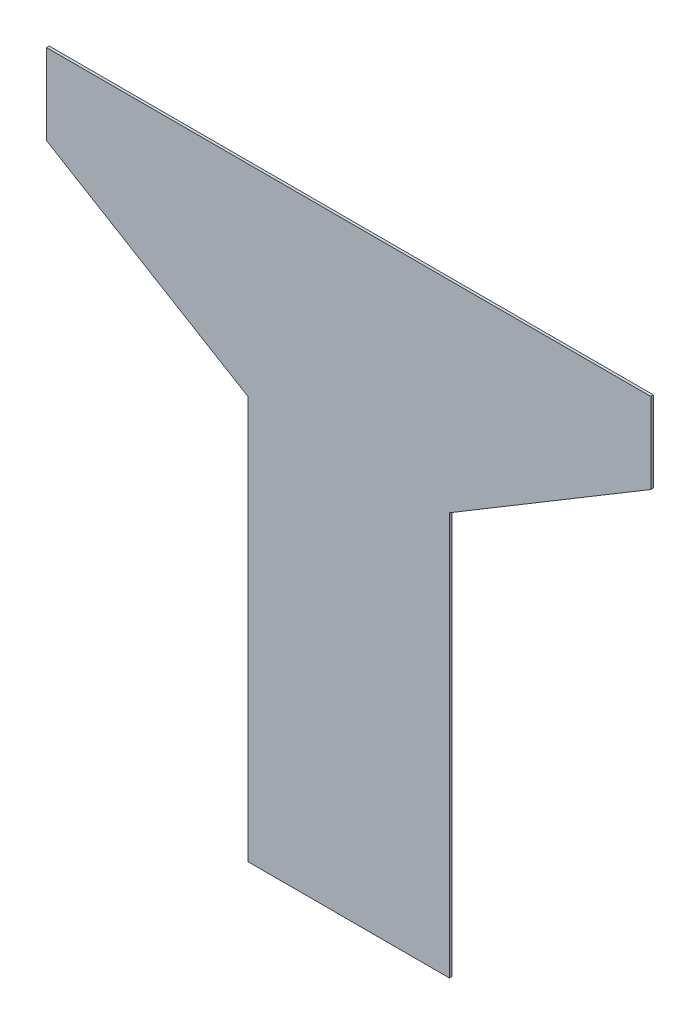
ISO-10303-21;
HEADER;
FILE_DESCRIPTION(('STEP AP214'),'2;1');
FILE_NAME('part.step','',(''),(''),'','','');
FILE_SCHEMA(('AUTOMOTIVE_DESIGN { 1 0 10303 214 1 1 1 1 }'));
ENDSEC;
DATA;
#1=APPLICATION_CONTEXT('core data for automotive mechanical design processes');
#2=APPLICATION_PROTOCOL_DEFINITION('international standard','automotive_design',2000,#1);
#3=PRODUCT_CONTEXT('',#1,'mechanical');
#4=PRODUCT('Part','Part','',(#3));
#5=PRODUCT_RELATED_PRODUCT_CATEGORY('part','',(#4));
#6=PRODUCT_DEFINITION_FORMATION('','',#4);
#7=PRODUCT_DEFINITION_CONTEXT('part definition',#1,'design');
#8=PRODUCT_DEFINITION('design','',#6,#7);
#9=PRODUCT_DEFINITION_SHAPE('','',#8);
#10=(LENGTH_UNIT() NAMED_UNIT(*) SI_UNIT(.MILLI.,.METRE.));
#11=(NAMED_UNIT(*) PLANE_ANGLE_UNIT() SI_UNIT($,.RADIAN.));
#12=(NAMED_UNIT(*) SI_UNIT($,.STERADIAN.) SOLID_ANGLE_UNIT());
#13=UNCERTAINTY_MEASURE_WITH_UNIT(LENGTH_MEASURE(1.E-05),#10,'distance_accuracy_value','');
#14=(GEOMETRIC_REPRESENTATION_CONTEXT(3) GLOBAL_UNCERTAINTY_ASSIGNED_CONTEXT((#13)) GLOBAL_UNIT_ASSIGNED_CONTEXT((#10,
#11,#12)) REPRESENTATION_CONTEXT('',''));
#15=CARTESIAN_POINT('',(0.,0.,0.));
#16=DIRECTION('',(0.,0.,1.));
#17=DIRECTION('',(1.,0.,0.));
#18=AXIS2_PLACEMENT_3D('',#15,#16,#17);
#19=CARTESIAN_POINT('',(-225.,54.0909090047148,1.33333333333333));
#20=DIRECTION('',(0.514495755427526,0.857492925712544,0.));
#21=DIRECTION('',(-0.857492925712544,0.514495755427526,0.));
#22=AXIS2_PLACEMENT_3D('',#19,#20,#21);
#23=PLANE('',#22);
#24=DIRECTION('',(0.857492925712544,-0.514495755427526,0.));
#25=VECTOR('',#24,1.);
#26=CARTESIAN_POINT('',(-225.,54.0909090047148,-0.666666666666667));
#27=LINE('',#26,#25);
#28=CARTESIAN_POINT('',(-225.,54.0909090047148,-0.666666666666667));
#29=VERTEX_POINT('',#28);
#30=CARTESIAN_POINT('',(-75.,-35.9090909952852,-0.666666666666667));
#31=VERTEX_POINT('',#30);
#32=EDGE_CURVE('E131',#29,#31,#27,.T.);
#33=ORIENTED_EDGE('',*,*,#32,.T.);
#34=DIRECTION('',(0.,0.,-1.));
#35=VECTOR('',#34,1.);
#36=CARTESIAN_POINT('',(-75.,-35.9090909952852,1.33333333333333));
#37=LINE('',#36,#35);
#38=CARTESIAN_POINT('',(-75.,-35.9090909952852,1.33333333333333));
#39=VERTEX_POINT('',#38);
#40=EDGE_CURVE('E11',#39,#31,#37,.T.);
#41=ORIENTED_EDGE('',*,*,#40,.F.);
#42=DIRECTION('',(0.857492925712544,-0.514495755427526,0.));
#43=VECTOR('',#42,1.);
#44=CARTESIAN_POINT('',(-225.,54.0909090047148,1.33333333333333));
#45=LINE('',#44,#43);
#46=CARTESIAN_POINT('',(-225.,54.0909090047148,1.33333333333333));
#47=VERTEX_POINT('',#46);
#48=EDGE_CURVE('E145',#47,#39,#45,.T.);
#49=ORIENTED_EDGE('',*,*,#48,.F.);
#50=DIRECTION('',(0.,0.,-1.));
#51=VECTOR('',#50,1.);
#52=CARTESIAN_POINT('',(-225.,54.0909090047148,1.33333333333333));
#53=LINE('',#52,#51);
#54=EDGE_CURVE('E127',#47,#29,#53,.T.);
#55=ORIENTED_EDGE('',*,*,#54,.T.);
#56=EDGE_LOOP('',(#33,#41,#49,#55));
#57=FACE_BOUND('',#56,.T.);
#58=ADVANCED_FACE('F35',(#57),#23,.F.);
#59=CARTESIAN_POINT('',(-75.,-35.9090909952852,1.33333333333333));
#60=DIRECTION('',(1.,0.,0.));
#61=DIRECTION('',(0.,1.,0.));
#62=AXIS2_PLACEMENT_3D('',#59,#60,#61);
#63=PLANE('',#62);
#64=DIRECTION('',(0.,-1.,0.));
#65=VECTOR('',#64,1.);
#66=CARTESIAN_POINT('',(-75.,-35.9090909952852,-0.666666666666667));
#67=LINE('',#66,#65);
#68=CARTESIAN_POINT('',(-75.,-335.909090689285,-0.666666666666667));
#69=VERTEX_POINT('',#68);
#70=EDGE_CURVE('E134',#31,#69,#67,.T.);
#71=ORIENTED_EDGE('',*,*,#70,.T.);
#72=DIRECTION('',(0.,0.,-1.));
#73=VECTOR('',#72,1.);
#74=CARTESIAN_POINT('',(-75.,-335.909090689285,1.33333333333333));
#75=LINE('',#74,#73);
#76=CARTESIAN_POINT('',(-75.,-335.909090689285,1.33333333333333));
#77=VERTEX_POINT('',#76);
#78=EDGE_CURVE('E43',#77,#69,#75,.T.);
#79=ORIENTED_EDGE('',*,*,#78,.F.);
#80=DIRECTION('',(0.,-1.,0.));
#81=VECTOR('',#80,1.);
#82=CARTESIAN_POINT('',(-75.,-35.9090909952852,1.33333333333333));
#83=LINE('',#82,#81);
#84=EDGE_CURVE('E94',#39,#77,#83,.T.);
#85=ORIENTED_EDGE('',*,*,#84,.F.);
#86=ORIENTED_EDGE('',*,*,#40,.T.);
#87=EDGE_LOOP('',(#71,#79,#85,#86));
#88=FACE_BOUND('',#87,.T.);
#89=ADVANCED_FACE('F180',(#88),#63,.F.);
#90=CARTESIAN_POINT('',(-75.,-335.909090689285,1.33333333333333));
#91=DIRECTION('',(0.,1.,0.));
#92=DIRECTION('',(0.,0.,1.));
#93=AXIS2_PLACEMENT_3D('',#90,#91,#92);
#94=PLANE('',#93);
#95=DIRECTION('',(1.,0.,0.));
#96=VECTOR('',#95,1.);
#97=CARTESIAN_POINT('',(-75.,-335.909090689285,-0.666666666666667));
#98=LINE('',#97,#96);
#99=CARTESIAN_POINT('',(75.,-335.909090689285,-0.666666666666667));
#100=VERTEX_POINT('',#99);
#101=EDGE_CURVE('E136',#69,#100,#98,.T.);
#102=ORIENTED_EDGE('',*,*,#101,.T.);
#103=DIRECTION('',(0.,0.,-1.));
#104=VECTOR('',#103,1.);
#105=CARTESIAN_POINT('',(75.,-335.909090689285,1.33333333333333));
#106=LINE('',#105,#104);
#107=CARTESIAN_POINT('',(75.,-335.909090689285,1.33333333333333));
#108=VERTEX_POINT('',#107);
#109=EDGE_CURVE('E152',#108,#100,#106,.T.);
#110=ORIENTED_EDGE('',*,*,#109,.F.);
#111=DIRECTION('',(1.,0.,0.));
#112=VECTOR('',#111,1.);
#113=CARTESIAN_POINT('',(-75.,-335.909090689285,1.33333333333333));
#114=LINE('',#113,#112);
#115=EDGE_CURVE('E160',#77,#108,#114,.T.);
#116=ORIENTED_EDGE('',*,*,#115,.F.);
#117=ORIENTED_EDGE('',*,*,#78,.T.);
#118=EDGE_LOOP('',(#102,#110,#116,#117));
#119=FACE_BOUND('',#118,.T.);
#120=ADVANCED_FACE('F158',(#119),#94,.F.);
#121=CARTESIAN_POINT('',(75.,-335.909090689285,1.33333333333333));
#122=DIRECTION('',(-1.,0.,0.));
#123=DIRECTION('',(0.,-1.,0.));
#124=AXIS2_PLACEMENT_3D('',#121,#122,#123);
#125=PLANE('',#124);
#126=DIRECTION('',(0.,1.,0.));
#127=VECTOR('',#126,1.);
#128=CARTESIAN_POINT('',(75.,-335.909090689285,-0.666666666666667));
#129=LINE('',#128,#127);
#130=CARTESIAN_POINT('',(75.,-35.9090909952852,-0.666666666666667));
#131=VERTEX_POINT('',#130);
#132=EDGE_CURVE('E138',#100,#131,#129,.T.);
#133=ORIENTED_EDGE('',*,*,#132,.T.);
#134=DIRECTION('',(0.,0.,-1.));
#135=VECTOR('',#134,1.);
#136=CARTESIAN_POINT('',(75.,-35.9090909952852,1.33333333333333));
#137=LINE('',#136,#135);
#138=CARTESIAN_POINT('',(75.,-35.9090909952852,1.33333333333333));
#139=VERTEX_POINT('',#138);
#140=EDGE_CURVE('E149',#139,#131,#137,.T.);
#141=ORIENTED_EDGE('',*,*,#140,.F.);
#142=DIRECTION('',(0.,1.,0.));
#143=VECTOR('',#142,1.);
#144=CARTESIAN_POINT('',(75.,-335.909090689285,1.33333333333333));
#145=LINE('',#144,#143);
#146=EDGE_CURVE('E172',#108,#139,#145,.T.);
#147=ORIENTED_EDGE('',*,*,#146,.F.);
#148=ORIENTED_EDGE('',*,*,#109,.T.);
#149=EDGE_LOOP('',(#133,#141,#147,#148));
#150=FACE_BOUND('',#149,.T.);
#151=ADVANCED_FACE('F168',(#150),#125,.F.);
#152=CARTESIAN_POINT('',(75.,-35.9090909952852,1.33333333333333));
#153=DIRECTION('',(-0.514495755427527,0.857492925712544,0.));
#154=DIRECTION('',(-0.857492925712544,-0.514495755427527,0.));
#155=AXIS2_PLACEMENT_3D('',#152,#153,#154);
#156=PLANE('',#155);
#157=DIRECTION('',(0.857492925712544,0.514495755427527,0.));
#158=VECTOR('',#157,1.);
#159=CARTESIAN_POINT('',(75.,-35.9090909952852,-0.666666666666667));
#160=LINE('',#159,#158);
#161=CARTESIAN_POINT('',(225.,54.0909090047149,-0.666666666666667));
#162=VERTEX_POINT('',#161);
#163=EDGE_CURVE('E140',#131,#162,#160,.T.);
#164=ORIENTED_EDGE('',*,*,#163,.T.);
#165=DIRECTION('',(0.,0.,-1.));
#166=VECTOR('',#165,1.);
#167=CARTESIAN_POINT('',(225.,54.0909090047149,1.33333333333333));
#168=LINE('',#167,#166);
#169=CARTESIAN_POINT('',(225.,54.0909090047149,1.33333333333333));
#170=VERTEX_POINT('',#169);
#171=EDGE_CURVE('E122',#170,#162,#168,.T.);
#172=ORIENTED_EDGE('',*,*,#171,.F.);
#173=DIRECTION('',(0.857492925712544,0.514495755427527,0.));
#174=VECTOR('',#173,1.);
#175=CARTESIAN_POINT('',(75.,-35.9090909952852,1.33333333333333));
#176=LINE('',#175,#174);
#177=EDGE_CURVE('E113',#139,#170,#176,.T.);
#178=ORIENTED_EDGE('',*,*,#177,.F.);
#179=ORIENTED_EDGE('',*,*,#140,.T.);
#180=EDGE_LOOP('',(#164,#172,#178,#179));
#181=FACE_BOUND('',#180,.T.);
#182=ADVANCED_FACE('F171',(#181),#156,.F.);
#183=CARTESIAN_POINT('',(225.,54.0909090047149,1.33333333333333));
#184=DIRECTION('',(-1.,0.,0.));
#185=DIRECTION('',(0.,0.,1.));
#186=AXIS2_PLACEMENT_3D('',#183,#184,#185);
#187=PLANE('',#186);
#188=DIRECTION('',(0.,1.,0.));
#189=VECTOR('',#188,1.);
#190=CARTESIAN_POINT('',(225.,54.0909090047149,-0.666666666666667));
#191=LINE('',#190,#189);
#192=CARTESIAN_POINT('',(225.,114.090909004715,-0.666666666666667));
#193=VERTEX_POINT('',#192);
#194=EDGE_CURVE('E121',#162,#193,#191,.T.);
#195=ORIENTED_EDGE('',*,*,#194,.T.);
#196=DIRECTION('',(0.,0.,-1.));
#197=VECTOR('',#196,1.);
#198=CARTESIAN_POINT('',(225.,114.090909004715,1.33333333333333));
#199=LINE('',#198,#197);
#200=CARTESIAN_POINT('',(225.,114.090909004715,1.33333333333333));
#201=VERTEX_POINT('',#200);
#202=EDGE_CURVE('E118',#201,#193,#199,.T.);
#203=ORIENTED_EDGE('',*,*,#202,.F.);
#204=DIRECTION('',(0.,1.,0.));
#205=VECTOR('',#204,1.);
#206=CARTESIAN_POINT('',(225.,54.0909090047149,1.33333333333333));
#207=LINE('',#206,#205);
#208=EDGE_CURVE('E107',#170,#201,#207,.T.);
#209=ORIENTED_EDGE('',*,*,#208,.F.);
#210=ORIENTED_EDGE('',*,*,#171,.T.);
#211=EDGE_LOOP('',(#195,#203,#209,#210));
#212=FACE_BOUND('',#211,.T.);
#213=ADVANCED_FACE('F119',(#212),#187,.F.);
#214=CARTESIAN_POINT('',(225.,114.090909004715,1.33333333333333));
#215=DIRECTION('',(0.,-1.,0.));
#216=DIRECTION('',(1.,0.,0.));
#217=AXIS2_PLACEMENT_3D('',#214,#215,#216);
#218=PLANE('',#217);
#219=DIRECTION('',(-1.,0.,0.));
#220=VECTOR('',#219,1.);
#221=CARTESIAN_POINT('',(225.,114.090909004715,-0.666666666666667));
#222=LINE('',#221,#220);
#223=CARTESIAN_POINT('',(-225.,114.090909004715,-0.666666666666667));
#224=VERTEX_POINT('',#223);
#225=EDGE_CURVE('E80',#193,#224,#222,.T.);
#226=ORIENTED_EDGE('',*,*,#225,.T.);
#227=DIRECTION('',(0.,0.,-1.));
#228=VECTOR('',#227,1.);
#229=CARTESIAN_POINT('',(-225.,114.090909004715,1.33333333333333));
#230=LINE('',#229,#228);
#231=CARTESIAN_POINT('',(-225.,114.090909004715,1.33333333333333));
#232=VERTEX_POINT('',#231);
#233=EDGE_CURVE('E123',#232,#224,#230,.T.);
#234=ORIENTED_EDGE('',*,*,#233,.F.);
#235=DIRECTION('',(-1.,0.,0.));
#236=VECTOR('',#235,1.);
#237=CARTESIAN_POINT('',(225.,114.090909004715,1.33333333333333));
#238=LINE('',#237,#236);
#239=EDGE_CURVE('E111',#201,#232,#238,.T.);
#240=ORIENTED_EDGE('',*,*,#239,.F.);
#241=ORIENTED_EDGE('',*,*,#202,.T.);
#242=EDGE_LOOP('',(#226,#234,#240,#241));
#243=FACE_BOUND('',#242,.T.);
#244=ADVANCED_FACE('F125',(#243),#218,.F.);
#245=CARTESIAN_POINT('',(-225.,114.090909004715,1.33333333333333));
#246=DIRECTION('',(1.,0.,0.));
#247=DIRECTION('',(0.,0.,-1.));
#248=AXIS2_PLACEMENT_3D('',#245,#246,#247);
#249=PLANE('',#248);
#250=DIRECTION('',(0.,-1.,0.));
#251=VECTOR('',#250,1.);
#252=CARTESIAN_POINT('',(-225.,114.090909004715,-0.666666666666667));
#253=LINE('',#252,#251);
#254=EDGE_CURVE('E86',#224,#29,#253,.T.);
#255=ORIENTED_EDGE('',*,*,#254,.T.);
#256=ORIENTED_EDGE('',*,*,#54,.F.);
#257=DIRECTION('',(0.,-1.,0.));
#258=VECTOR('',#257,1.);
#259=CARTESIAN_POINT('',(-225.,114.090909004715,1.33333333333333));
#260=LINE('',#259,#258);
#261=EDGE_CURVE('E51',#232,#47,#260,.T.);
#262=ORIENTED_EDGE('',*,*,#261,.F.);
#263=ORIENTED_EDGE('',*,*,#233,.T.);
#264=EDGE_LOOP('',(#255,#256,#262,#263));
#265=FACE_BOUND('',#264,.T.);
#266=ADVANCED_FACE('F196',(#265),#249,.F.);
#267=CARTESIAN_POINT('',(0.,114.090909004715,1.33333333333333));
#268=DIRECTION('',(0.,0.,1.));
#269=DIRECTION('',(1.,0.,0.));
#270=AXIS2_PLACEMENT_3D('',#267,#268,#269);
#271=PLANE('',#270);
#272=ORIENTED_EDGE('',*,*,#48,.T.);
#273=ORIENTED_EDGE('',*,*,#84,.T.);
#274=ORIENTED_EDGE('',*,*,#115,.T.);
#275=ORIENTED_EDGE('',*,*,#146,.T.);
#276=ORIENTED_EDGE('',*,*,#177,.T.);
#277=ORIENTED_EDGE('',*,*,#208,.T.);
#278=ORIENTED_EDGE('',*,*,#239,.T.);
#279=ORIENTED_EDGE('',*,*,#261,.T.);
#280=EDGE_LOOP('',(#272,#273,#274,#275,#276,#277,#278,#279));
#281=FACE_BOUND('',#280,.T.);
#282=ADVANCED_FACE('F109',(#281),#271,.T.);
#283=CARTESIAN_POINT('',(0.,114.090909004715,-0.666666666666667));
#284=DIRECTION('',(0.,0.,1.));
#285=DIRECTION('',(1.,0.,0.));
#286=AXIS2_PLACEMENT_3D('',#283,#284,#285);
#287=PLANE('',#286);
#288=ORIENTED_EDGE('',*,*,#32,.F.);
#289=ORIENTED_EDGE('',*,*,#254,.F.);
#290=ORIENTED_EDGE('',*,*,#225,.F.);
#291=ORIENTED_EDGE('',*,*,#194,.F.);
#292=ORIENTED_EDGE('',*,*,#163,.F.);
#293=ORIENTED_EDGE('',*,*,#132,.F.);
#294=ORIENTED_EDGE('',*,*,#101,.F.);
#295=ORIENTED_EDGE('',*,*,#70,.F.);
#296=EDGE_LOOP('',(#288,#289,#290,#291,#292,#293,#294,#295));
#297=FACE_BOUND('',#296,.T.);
#298=ADVANCED_FACE('F164',(#297),#287,.F.);
#299=CLOSED_SHELL('',(#58,#89,#120,#151,#182,#213,#244,#266,#282,#298));
#300=MANIFOLD_SOLID_BREP('B2',#299);
#301=ADVANCED_BREP_SHAPE_REPRESENTATION('',(#18,#300),#14);
#302=SHAPE_DEFINITION_REPRESENTATION(#9,#301);
ENDSEC;
END-ISO-10303-21;
